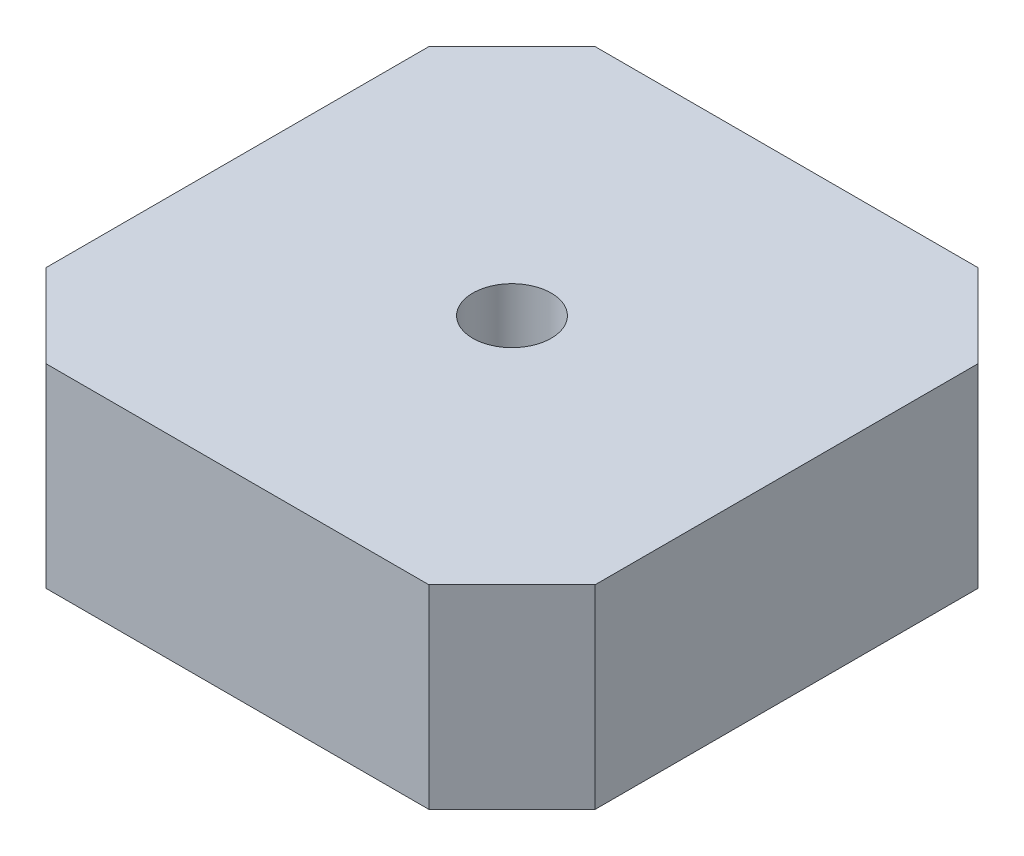
ISO-10303-21;
HEADER;
FILE_DESCRIPTION(('STEP AP214'),'2;1');
FILE_NAME('part.step','',(''),(''),'','','');
FILE_SCHEMA(('AUTOMOTIVE_DESIGN { 1 0 10303 214 1 1 1 1 }'));
ENDSEC;
DATA;
#1=APPLICATION_CONTEXT('core data for automotive mechanical design processes');
#2=APPLICATION_PROTOCOL_DEFINITION('international standard','automotive_design',2000,#1);
#3=PRODUCT_CONTEXT('',#1,'mechanical');
#4=PRODUCT('Part','Part','',(#3));
#5=PRODUCT_RELATED_PRODUCT_CATEGORY('part','',(#4));
#6=PRODUCT_DEFINITION_FORMATION('','',#4);
#7=PRODUCT_DEFINITION_CONTEXT('part definition',#1,'design');
#8=PRODUCT_DEFINITION('design','',#6,#7);
#9=PRODUCT_DEFINITION_SHAPE('','',#8);
#10=(LENGTH_UNIT() NAMED_UNIT(*) SI_UNIT(.MILLI.,.METRE.));
#11=(NAMED_UNIT(*) PLANE_ANGLE_UNIT() SI_UNIT($,.RADIAN.));
#12=(NAMED_UNIT(*) SI_UNIT($,.STERADIAN.) SOLID_ANGLE_UNIT());
#13=UNCERTAINTY_MEASURE_WITH_UNIT(LENGTH_MEASURE(1.E-05),#10,'distance_accuracy_value','');
#14=(GEOMETRIC_REPRESENTATION_CONTEXT(3) GLOBAL_UNCERTAINTY_ASSIGNED_CONTEXT((#13)) GLOBAL_UNIT_ASSIGNED_CONTEXT((#10,
#11,#12)) REPRESENTATION_CONTEXT('',''));
#15=CARTESIAN_POINT('',(0.,0.,0.));
#16=DIRECTION('',(0.,0.,1.));
#17=DIRECTION('',(1.,0.,0.));
#18=AXIS2_PLACEMENT_3D('',#15,#16,#17);
#19=CARTESIAN_POINT('',(0.,12.4,0.));
#20=DIRECTION('',(1.,0.,0.));
#21=DIRECTION('',(0.,0.,-1.));
#22=AXIS2_PLACEMENT_3D('',#19,#20,#21);
#23=PLANE('',#22);
#24=DIRECTION('',(0.,1.,0.));
#25=VECTOR('',#24,1.);
#26=CARTESIAN_POINT('',(0.,-5.6,-5.30151519016501));
#27=LINE('',#26,#25);
#28=CARTESIAN_POINT('',(0.,0.,-5.30151519016501));
#29=VERTEX_POINT('',#28);
#30=CARTESIAN_POINT('',(0.,12.4,-5.30151519016501));
#31=VERTEX_POINT('',#30);
#32=EDGE_CURVE('E113',#29,#31,#27,.T.);
#33=ORIENTED_EDGE('',*,*,#32,.T.);
#34=DIRECTION('',(0.,0.,1.));
#35=VECTOR('',#34,1.);
#36=CARTESIAN_POINT('',(0.,12.4,0.));
#37=LINE('',#36,#35);
#38=CARTESIAN_POINT('',(0.,12.4,-29.698484809835));
#39=VERTEX_POINT('',#38);
#40=EDGE_CURVE('E122',#39,#31,#37,.T.);
#41=ORIENTED_EDGE('',*,*,#40,.F.);
#42=DIRECTION('',(0.,1.,0.));
#43=VECTOR('',#42,1.);
#44=CARTESIAN_POINT('',(0.,-5.6,-29.698484809835));
#45=LINE('',#44,#43);
#46=CARTESIAN_POINT('',(0.,0.,-29.698484809835));
#47=VERTEX_POINT('',#46);
#48=EDGE_CURVE('E102',#47,#39,#45,.T.);
#49=ORIENTED_EDGE('',*,*,#48,.F.);
#50=DIRECTION('',(0.,0.,1.));
#51=VECTOR('',#50,1.);
#52=CARTESIAN_POINT('',(0.,0.,0.));
#53=LINE('',#52,#51);
#54=EDGE_CURVE('E143',#47,#29,#53,.T.);
#55=ORIENTED_EDGE('',*,*,#54,.T.);
#56=EDGE_LOOP('',(#33,#41,#49,#55));
#57=FACE_BOUND('',#56,.T.);
#58=ADVANCED_FACE('F40',(#57),#23,.F.);
#59=CARTESIAN_POINT('',(0.,12.4,0.));
#60=DIRECTION('',(0.,0.,-1.));
#61=DIRECTION('',(-1.,0.,0.));
#62=AXIS2_PLACEMENT_3D('',#59,#60,#61);
#63=PLANE('',#62);
#64=DIRECTION('',(0.,1.,0.));
#65=VECTOR('',#64,1.);
#66=CARTESIAN_POINT('',(29.698484809835,-5.6,0.));
#67=LINE('',#66,#65);
#68=CARTESIAN_POINT('',(29.698484809835,0.,0.));
#69=VERTEX_POINT('',#68);
#70=CARTESIAN_POINT('',(29.698484809835,12.4,0.));
#71=VERTEX_POINT('',#70);
#72=EDGE_CURVE('E54',#69,#71,#67,.T.);
#73=ORIENTED_EDGE('',*,*,#72,.T.);
#74=DIRECTION('',(1.,0.,0.));
#75=VECTOR('',#74,1.);
#76=CARTESIAN_POINT('',(0.,12.4,0.));
#77=LINE('',#76,#75);
#78=CARTESIAN_POINT('',(5.30151519016499,12.4,0.));
#79=VERTEX_POINT('',#78);
#80=EDGE_CURVE('E129',#79,#71,#77,.T.);
#81=ORIENTED_EDGE('',*,*,#80,.F.);
#82=DIRECTION('',(0.,1.,0.));
#83=VECTOR('',#82,1.);
#84=CARTESIAN_POINT('',(5.30151519016499,-5.6,0.));
#85=LINE('',#84,#83);
#86=CARTESIAN_POINT('',(5.30151519016499,0.,0.));
#87=VERTEX_POINT('',#86);
#88=EDGE_CURVE('E164',#87,#79,#85,.T.);
#89=ORIENTED_EDGE('',*,*,#88,.F.);
#90=DIRECTION('',(1.,0.,0.));
#91=VECTOR('',#90,1.);
#92=CARTESIAN_POINT('',(0.,0.,0.));
#93=LINE('',#92,#91);
#94=EDGE_CURVE('E145',#87,#69,#93,.T.);
#95=ORIENTED_EDGE('',*,*,#94,.T.);
#96=EDGE_LOOP('',(#73,#81,#89,#95));
#97=FACE_BOUND('',#96,.T.);
#98=ADVANCED_FACE('F162',(#97),#63,.F.);
#99=CARTESIAN_POINT('',(35.,12.4,0.));
#100=DIRECTION('',(-1.,0.,0.));
#101=DIRECTION('',(0.,0.,1.));
#102=AXIS2_PLACEMENT_3D('',#99,#100,#101);
#103=PLANE('',#102);
#104=DIRECTION('',(0.,1.,0.));
#105=VECTOR('',#104,1.);
#106=CARTESIAN_POINT('',(35.,-5.6,-29.698484809835));
#107=LINE('',#106,#105);
#108=CARTESIAN_POINT('',(35.,0.,-29.698484809835));
#109=VERTEX_POINT('',#108);
#110=CARTESIAN_POINT('',(35.,12.4,-29.698484809835));
#111=VERTEX_POINT('',#110);
#112=EDGE_CURVE('E62',#109,#111,#107,.T.);
#113=ORIENTED_EDGE('',*,*,#112,.T.);
#114=DIRECTION('',(0.,0.,-1.));
#115=VECTOR('',#114,1.);
#116=CARTESIAN_POINT('',(35.,12.4,0.));
#117=LINE('',#116,#115);
#118=CARTESIAN_POINT('',(35.,12.4,-5.30151519016499));
#119=VERTEX_POINT('',#118);
#120=EDGE_CURVE('E133',#119,#111,#117,.T.);
#121=ORIENTED_EDGE('',*,*,#120,.F.);
#122=DIRECTION('',(0.,1.,0.));
#123=VECTOR('',#122,1.);
#124=CARTESIAN_POINT('',(35.,-5.6,-5.30151519016499));
#125=LINE('',#124,#123);
#126=CARTESIAN_POINT('',(35.,0.,-5.30151519016499));
#127=VERTEX_POINT('',#126);
#128=EDGE_CURVE('E167',#127,#119,#125,.T.);
#129=ORIENTED_EDGE('',*,*,#128,.F.);
#130=DIRECTION('',(0.,0.,-1.));
#131=VECTOR('',#130,1.);
#132=CARTESIAN_POINT('',(35.,0.,0.));
#133=LINE('',#132,#131);
#134=EDGE_CURVE('E136',#127,#109,#133,.T.);
#135=ORIENTED_EDGE('',*,*,#134,.T.);
#136=EDGE_LOOP('',(#113,#121,#129,#135));
#137=FACE_BOUND('',#136,.T.);
#138=ADVANCED_FACE('F203',(#137),#103,.F.);
#139=CARTESIAN_POINT('',(0.,12.4,-35.));
#140=DIRECTION('',(0.,0.,1.));
#141=DIRECTION('',(1.,0.,0.));
#142=AXIS2_PLACEMENT_3D('',#139,#140,#141);
#143=PLANE('',#142);
#144=DIRECTION('',(0.,1.,0.));
#145=VECTOR('',#144,1.);
#146=CARTESIAN_POINT('',(29.698484809835,-5.6,-35.));
#147=LINE('',#146,#145);
#148=CARTESIAN_POINT('',(29.698484809835,0.,-35.));
#149=VERTEX_POINT('',#148);
#150=CARTESIAN_POINT('',(29.698484809835,12.4,-35.));
#151=VERTEX_POINT('',#150);
#152=EDGE_CURVE('E146',#149,#151,#147,.T.);
#153=ORIENTED_EDGE('',*,*,#152,.F.);
#154=DIRECTION('',(-1.,0.,0.));
#155=VECTOR('',#154,1.);
#156=CARTESIAN_POINT('',(0.,0.,-35.));
#157=LINE('',#156,#155);
#158=CARTESIAN_POINT('',(5.30151519016502,0.,-35.));
#159=VERTEX_POINT('',#158);
#160=EDGE_CURVE('E130',#149,#159,#157,.T.);
#161=ORIENTED_EDGE('',*,*,#160,.T.);
#162=DIRECTION('',(0.,1.,0.));
#163=VECTOR('',#162,1.);
#164=CARTESIAN_POINT('',(5.30151519016501,-5.6,-35.));
#165=LINE('',#164,#163);
#166=CARTESIAN_POINT('',(5.30151519016501,12.4,-35.));
#167=VERTEX_POINT('',#166);
#168=EDGE_CURVE('E114',#159,#167,#165,.T.);
#169=ORIENTED_EDGE('',*,*,#168,.T.);
#170=DIRECTION('',(-1.,0.,0.));
#171=VECTOR('',#170,1.);
#172=CARTESIAN_POINT('',(0.,12.4,-35.));
#173=LINE('',#172,#171);
#174=EDGE_CURVE('E124',#151,#167,#173,.T.);
#175=ORIENTED_EDGE('',*,*,#174,.F.);
#176=EDGE_LOOP('',(#153,#161,#169,#175));
#177=FACE_BOUND('',#176,.T.);
#178=ADVANCED_FACE('F195',(#177),#143,.F.);
#179=CARTESIAN_POINT('',(0.,12.4,0.));
#180=DIRECTION('',(0.,-1.,0.));
#181=DIRECTION('',(0.,0.,-1.));
#182=AXIS2_PLACEMENT_3D('',#179,#180,#181);
#183=PLANE('',#182);
#184=CARTESIAN_POINT('',(17.5,12.4,-17.5));
#185=DIRECTION('',(0.,1.,0.));
#186=DIRECTION('',(0.,0.,1.));
#187=AXIS2_PLACEMENT_3D('',#184,#185,#186);
#188=CIRCLE('',#187,2.5);
#189=CARTESIAN_POINT('',(17.5,12.4,-15.));
#190=VERTEX_POINT('',#189);
#191=EDGE_CURVE('E180',#190,#190,#188,.T.);
#192=ORIENTED_EDGE('',*,*,#191,.F.);
#193=EDGE_LOOP('',(#192));
#194=FACE_BOUND('',#193,.T.);
#195=DIRECTION('',(-0.707106781186546,0.,-0.707106781186549));
#196=VECTOR('',#195,1.);
#197=CARTESIAN_POINT('',(35.,12.4,-29.698484809835));
#198=LINE('',#197,#196);
#199=EDGE_CURVE('E174',#111,#151,#198,.T.);
#200=ORIENTED_EDGE('',*,*,#199,.T.);
#201=ORIENTED_EDGE('',*,*,#174,.T.);
#202=DIRECTION('',(-0.707106781186549,0.,0.707106781186546));
#203=VECTOR('',#202,1.);
#204=CARTESIAN_POINT('',(5.30151519016501,12.4,-35.));
#205=LINE('',#204,#203);
#206=EDGE_CURVE('E105',#167,#39,#205,.T.);
#207=ORIENTED_EDGE('',*,*,#206,.T.);
#208=ORIENTED_EDGE('',*,*,#40,.T.);
#209=DIRECTION('',(0.707106781186546,0.,0.707106781186549));
#210=VECTOR('',#209,1.);
#211=CARTESIAN_POINT('',(0.,12.4,-5.30151519016501));
#212=LINE('',#211,#210);
#213=EDGE_CURVE('E125',#31,#79,#212,.T.);
#214=ORIENTED_EDGE('',*,*,#213,.T.);
#215=ORIENTED_EDGE('',*,*,#80,.T.);
#216=DIRECTION('',(0.707106781186549,0.,-0.707106781186546));
#217=VECTOR('',#216,1.);
#218=CARTESIAN_POINT('',(29.698484809835,12.4,0.));
#219=LINE('',#218,#217);
#220=EDGE_CURVE('E176',#71,#119,#219,.T.);
#221=ORIENTED_EDGE('',*,*,#220,.T.);
#222=ORIENTED_EDGE('',*,*,#120,.T.);
#223=EDGE_LOOP('',(#200,#201,#207,#208,#214,#215,#221,#222));
#224=FACE_BOUND('',#223,.T.);
#225=ADVANCED_FACE('F120',(#194,#224),#183,.F.);
#226=CARTESIAN_POINT('',(0.,0.,0.));
#227=DIRECTION('',(0.,-1.,0.));
#228=DIRECTION('',(0.,0.,-1.));
#229=AXIS2_PLACEMENT_3D('',#226,#227,#228);
#230=PLANE('',#229);
#231=CARTESIAN_POINT('',(17.5,0.,-17.5));
#232=DIRECTION('',(0.,1.,0.));
#233=DIRECTION('',(0.,0.,1.));
#234=AXIS2_PLACEMENT_3D('',#231,#232,#233);
#235=CIRCLE('',#234,2.5);
#236=CARTESIAN_POINT('',(17.5,0.,-15.));
#237=VERTEX_POINT('',#236);
#238=EDGE_CURVE('E126',#237,#237,#235,.T.);
#239=ORIENTED_EDGE('',*,*,#238,.T.);
#240=EDGE_LOOP('',(#239));
#241=FACE_BOUND('',#240,.T.);
#242=ORIENTED_EDGE('',*,*,#160,.F.);
#243=DIRECTION('',(0.707106781186546,0.,0.707106781186549));
#244=VECTOR('',#243,1.);
#245=CARTESIAN_POINT('',(32.3492424049176,0.,-32.3492424049174));
#246=LINE('',#245,#244);
#247=EDGE_CURVE('E12',#149,#109,#246,.T.);
#248=ORIENTED_EDGE('',*,*,#247,.T.);
#249=ORIENTED_EDGE('',*,*,#134,.F.);
#250=DIRECTION('',(-0.707106781186549,0.,0.707106781186546));
#251=VECTOR('',#250,1.);
#252=CARTESIAN_POINT('',(14.8492424049174,0.,14.8492424049175));
#253=LINE('',#252,#251);
#254=EDGE_CURVE('E47',#127,#69,#253,.T.);
#255=ORIENTED_EDGE('',*,*,#254,.T.);
#256=ORIENTED_EDGE('',*,*,#94,.F.);
#257=DIRECTION('',(-0.707106781186546,0.,-0.707106781186549));
#258=VECTOR('',#257,1.);
#259=CARTESIAN_POINT('',(2.65075759508251,0.,-2.6507575950825));
#260=LINE('',#259,#258);
#261=EDGE_CURVE('E152',#87,#29,#260,.T.);
#262=ORIENTED_EDGE('',*,*,#261,.T.);
#263=ORIENTED_EDGE('',*,*,#54,.F.);
#264=DIRECTION('',(0.707106781186549,0.,-0.707106781186546));
#265=VECTOR('',#264,1.);
#266=CARTESIAN_POINT('',(-14.8492424049175,0.,-14.8492424049176));
#267=LINE('',#266,#265);
#268=EDGE_CURVE('E108',#47,#159,#267,.T.);
#269=ORIENTED_EDGE('',*,*,#268,.T.);
#270=EDGE_LOOP('',(#242,#248,#249,#255,#256,#262,#263,#269));
#271=FACE_BOUND('',#270,.T.);
#272=ADVANCED_FACE('F158',(#241,#271),#230,.T.);
#273=CARTESIAN_POINT('',(5.30151519016501,-5.6,-35.));
#274=DIRECTION('',(-0.707106781186546,0.,-0.707106781186549));
#275=DIRECTION('',(-0.707106781186549,0.,0.707106781186546));
#276=AXIS2_PLACEMENT_3D('',#273,#274,#275);
#277=PLANE('',#276);
#278=ORIENTED_EDGE('',*,*,#48,.T.);
#279=ORIENTED_EDGE('',*,*,#206,.F.);
#280=ORIENTED_EDGE('',*,*,#168,.F.);
#281=ORIENTED_EDGE('',*,*,#268,.F.);
#282=EDGE_LOOP('',(#278,#279,#280,#281));
#283=FACE_BOUND('',#282,.T.);
#284=ADVANCED_FACE('F104',(#283),#277,.T.);
#285=CARTESIAN_POINT('',(0.,-5.6,-5.30151519016501));
#286=DIRECTION('',(-0.707106781186549,0.,0.707106781186546));
#287=DIRECTION('',(0.707106781186546,0.,0.707106781186549));
#288=AXIS2_PLACEMENT_3D('',#285,#286,#287);
#289=PLANE('',#288);
#290=ORIENTED_EDGE('',*,*,#88,.T.);
#291=ORIENTED_EDGE('',*,*,#213,.F.);
#292=ORIENTED_EDGE('',*,*,#32,.F.);
#293=ORIENTED_EDGE('',*,*,#261,.F.);
#294=EDGE_LOOP('',(#290,#291,#292,#293));
#295=FACE_BOUND('',#294,.T.);
#296=ADVANCED_FACE('F221',(#295),#289,.T.);
#297=CARTESIAN_POINT('',(29.698484809835,-5.6,0.));
#298=DIRECTION('',(0.707106781186546,0.,0.707106781186549));
#299=DIRECTION('',(0.707106781186549,0.,-0.707106781186546));
#300=AXIS2_PLACEMENT_3D('',#297,#298,#299);
#301=PLANE('',#300);
#302=ORIENTED_EDGE('',*,*,#128,.T.);
#303=ORIENTED_EDGE('',*,*,#220,.F.);
#304=ORIENTED_EDGE('',*,*,#72,.F.);
#305=ORIENTED_EDGE('',*,*,#254,.F.);
#306=EDGE_LOOP('',(#302,#303,#304,#305));
#307=FACE_BOUND('',#306,.T.);
#308=ADVANCED_FACE('F219',(#307),#301,.T.);
#309=CARTESIAN_POINT('',(35.,-5.6,-29.698484809835));
#310=DIRECTION('',(0.707106781186549,0.,-0.707106781186546));
#311=DIRECTION('',(-0.707106781186546,0.,-0.707106781186549));
#312=AXIS2_PLACEMENT_3D('',#309,#310,#311);
#313=PLANE('',#312);
#314=ORIENTED_EDGE('',*,*,#152,.T.);
#315=ORIENTED_EDGE('',*,*,#199,.F.);
#316=ORIENTED_EDGE('',*,*,#112,.F.);
#317=ORIENTED_EDGE('',*,*,#247,.F.);
#318=EDGE_LOOP('',(#314,#315,#316,#317));
#319=FACE_BOUND('',#318,.T.);
#320=ADVANCED_FACE('F190',(#319),#313,.T.);
#321=CARTESIAN_POINT('',(17.5,0.,-17.5));
#322=DIRECTION('',(0.,1.,0.));
#323=DIRECTION('',(0.,0.,1.));
#324=AXIS2_PLACEMENT_3D('',#321,#322,#323);
#325=CYLINDRICAL_SURFACE('',#324,2.5);
#326=CARTESIAN_POINT('',(17.5,0.,-15.));
#327=CARTESIAN_POINT('',(17.5,0.129166666666667,-15.));
#328=CARTESIAN_POINT('',(17.5,0.258333333333333,-15.));
#329=CARTESIAN_POINT('',(17.5,0.516666666666667,-15.));
#330=CARTESIAN_POINT('',(17.5,0.645833333333333,-15.));
#331=CARTESIAN_POINT('',(17.5,0.904166666666667,-15.));
#332=CARTESIAN_POINT('',(17.5,1.03333333333333,-15.));
#333=CARTESIAN_POINT('',(17.5,1.29166666666667,-15.));
#334=CARTESIAN_POINT('',(17.5,1.42083333333333,-15.));
#335=CARTESIAN_POINT('',(17.5,1.67916666666667,-15.));
#336=CARTESIAN_POINT('',(17.5,1.80833333333333,-15.));
#337=CARTESIAN_POINT('',(17.5,2.06666666666667,-15.));
#338=CARTESIAN_POINT('',(17.5,2.19583333333333,-15.));
#339=CARTESIAN_POINT('',(17.5,2.45416666666667,-15.));
#340=CARTESIAN_POINT('',(17.5,2.58333333333333,-15.));
#341=CARTESIAN_POINT('',(17.5,2.84166666666667,-15.));
#342=CARTESIAN_POINT('',(17.5,2.97083333333333,-15.));
#343=CARTESIAN_POINT('',(17.5,3.22916666666667,-15.));
#344=CARTESIAN_POINT('',(17.5,3.35833333333333,-15.));
#345=CARTESIAN_POINT('',(17.5,3.61666666666667,-15.));
#346=CARTESIAN_POINT('',(17.5,3.74583333333333,-15.));
#347=CARTESIAN_POINT('',(17.5,4.00416666666667,-15.));
#348=CARTESIAN_POINT('',(17.5,4.13333333333333,-15.));
#349=CARTESIAN_POINT('',(17.5,4.39166666666667,-15.));
#350=CARTESIAN_POINT('',(17.5,4.52083333333333,-15.));
#351=CARTESIAN_POINT('',(17.5,4.77916666666667,-15.));
#352=CARTESIAN_POINT('',(17.5,4.90833333333333,-15.));
#353=CARTESIAN_POINT('',(17.5,5.16666666666667,-15.));
#354=CARTESIAN_POINT('',(17.5,5.29583333333333,-15.));
#355=CARTESIAN_POINT('',(17.5,5.55416666666667,-15.));
#356=CARTESIAN_POINT('',(17.5,5.68333333333333,-15.));
#357=CARTESIAN_POINT('',(17.5,5.94166666666667,-15.));
#358=CARTESIAN_POINT('',(17.5,6.07083333333333,-15.));
#359=CARTESIAN_POINT('',(17.5,6.32916666666667,-15.));
#360=CARTESIAN_POINT('',(17.5,6.45833333333333,-15.));
#361=CARTESIAN_POINT('',(17.5,6.71666666666667,-15.));
#362=CARTESIAN_POINT('',(17.5,6.84583333333333,-15.));
#363=CARTESIAN_POINT('',(17.5,7.10416666666667,-15.));
#364=CARTESIAN_POINT('',(17.5,7.23333333333333,-15.));
#365=CARTESIAN_POINT('',(17.5,7.49166666666667,-15.));
#366=CARTESIAN_POINT('',(17.5,7.62083333333333,-15.));
#367=CARTESIAN_POINT('',(17.5,7.87916666666667,-15.));
#368=CARTESIAN_POINT('',(17.5,8.00833333333333,-15.));
#369=CARTESIAN_POINT('',(17.5,8.26666666666667,-15.));
#370=CARTESIAN_POINT('',(17.5,8.39583333333333,-15.));
#371=CARTESIAN_POINT('',(17.5,8.65416666666667,-15.));
#372=CARTESIAN_POINT('',(17.5,8.78333333333333,-15.));
#373=CARTESIAN_POINT('',(17.5,9.04166666666666,-15.));
#374=CARTESIAN_POINT('',(17.5,9.17083333333333,-15.));
#375=CARTESIAN_POINT('',(17.5,9.42916666666667,-15.));
#376=CARTESIAN_POINT('',(17.5,9.55833333333333,-15.));
#377=CARTESIAN_POINT('',(17.5,9.81666666666667,-15.));
#378=CARTESIAN_POINT('',(17.5,9.94583333333333,-15.));
#379=CARTESIAN_POINT('',(17.5,10.2041666666667,-15.));
#380=CARTESIAN_POINT('',(17.5,10.3333333333333,-15.));
#381=CARTESIAN_POINT('',(17.5,10.5916666666667,-15.));
#382=CARTESIAN_POINT('',(17.5,10.7208333333333,-15.));
#383=CARTESIAN_POINT('',(17.5,10.9791666666667,-15.));
#384=CARTESIAN_POINT('',(17.5,11.1083333333333,-15.));
#385=CARTESIAN_POINT('',(17.5,11.3666666666667,-15.));
#386=CARTESIAN_POINT('',(17.5,11.4958333333333,-15.));
#387=CARTESIAN_POINT('',(17.5,11.7541666666667,-15.));
#388=CARTESIAN_POINT('',(17.5,11.8833333333333,-15.));
#389=CARTESIAN_POINT('',(17.5,12.1416666666667,-15.));
#390=CARTESIAN_POINT('',(17.5,12.2708333333333,-15.));
#391=CARTESIAN_POINT('',(17.5,12.4,-15.));
#392=B_SPLINE_CURVE_WITH_KNOTS('',3,(#326,#327,#328,#329,#330,#331,#332,#333,#334,#335,#336,
#337,#338,#339,#340,#341,#342,#343,#344,#345,#346,#347,#348,#349,#350,#351,#352,#353,#354,#355,
#356,#357,#358,#359,#360,#361,#362,#363,#364,#365,#366,#367,#368,#369,#370,#371,#372,#373,#374,
#375,#376,#377,#378,#379,#380,#381,#382,#383,#384,#385,#386,#387,#388,#389,#390,#391),
.UNSPECIFIED.,.F.,.F.,(4,2,2,2,2,2,2,2,2,2,2,2,2,2,2,2,2,2,2,2,2,2,2,2,2,2,2,2,2,2,2,2,4),(0.,
0.3875,0.775,1.1625,1.55,1.9375,2.325,2.7125,3.1,3.4875,3.875,4.2625,4.65,5.0375,5.425,5.8125,
6.2,6.5875,6.975,7.3625,7.75,8.1375,8.525,8.9125,9.3,9.6875,10.075,10.4625,10.85,11.2375,11.625,
12.0125,12.4),.UNSPECIFIED.);
#393=EDGE_CURVE('BSEAM187',#237,#190,#392,.T.);
#394=ORIENTED_EDGE('',*,*,#238,.F.);
#395=ORIENTED_EDGE('',*,*,#191,.T.);
#396=ORIENTED_EDGE('',*,*,#393,.T.);
#397=ORIENTED_EDGE('',*,*,#393,.F.);
#398=EDGE_LOOP('',(#394,#396,#395,#397));
#399=FACE_BOUND('',#398,.T.);
#400=ADVANCED_FACE('F187',(#399),#325,.F.);
#401=CLOSED_SHELL('',(#58,#98,#138,#178,#225,#272,#284,#296,#308,#320,#400));
#402=MANIFOLD_SOLID_BREP('B2',#401);
#403=ADVANCED_BREP_SHAPE_REPRESENTATION('',(#18,#402),#14);
#404=SHAPE_DEFINITION_REPRESENTATION(#9,#403);
ENDSEC;
END-ISO-10303-21;
